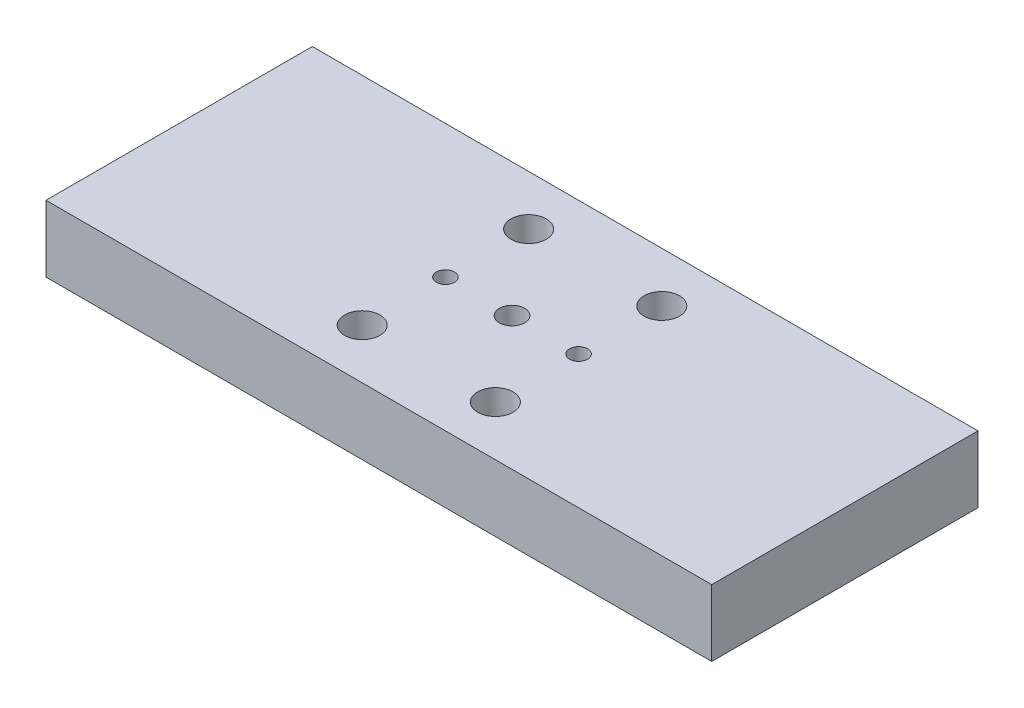
ISO-10303-21;
HEADER;
FILE_DESCRIPTION(('STEP AP214'),'2;1');
FILE_NAME('part.step','',(''),(''),'','','');
FILE_SCHEMA(('AUTOMOTIVE_DESIGN { 1 0 10303 214 1 1 1 1 }'));
ENDSEC;
DATA;
#1=APPLICATION_CONTEXT('core data for automotive mechanical design processes');
#2=APPLICATION_PROTOCOL_DEFINITION('international standard','automotive_design',2000,#1);
#3=PRODUCT_CONTEXT('',#1,'mechanical');
#4=PRODUCT('Part','Part','',(#3));
#5=PRODUCT_RELATED_PRODUCT_CATEGORY('part','',(#4));
#6=PRODUCT_DEFINITION_FORMATION('','',#4);
#7=PRODUCT_DEFINITION_CONTEXT('part definition',#1,'design');
#8=PRODUCT_DEFINITION('design','',#6,#7);
#9=PRODUCT_DEFINITION_SHAPE('','',#8);
#10=(LENGTH_UNIT() NAMED_UNIT(*) SI_UNIT(.MILLI.,.METRE.));
#11=(NAMED_UNIT(*) PLANE_ANGLE_UNIT() SI_UNIT($,.RADIAN.));
#12=(NAMED_UNIT(*) SI_UNIT($,.STERADIAN.) SOLID_ANGLE_UNIT());
#13=UNCERTAINTY_MEASURE_WITH_UNIT(LENGTH_MEASURE(1.E-05),#10,'distance_accuracy_value','');
#14=(GEOMETRIC_REPRESENTATION_CONTEXT(3) GLOBAL_UNCERTAINTY_ASSIGNED_CONTEXT((#13)) GLOBAL_UNIT_ASSIGNED_CONTEXT((#10,
#11,#12)) REPRESENTATION_CONTEXT('',''));
#15=CARTESIAN_POINT('',(0.,0.,0.));
#16=DIRECTION('',(0.,0.,1.));
#17=DIRECTION('',(1.,0.,0.));
#18=AXIS2_PLACEMENT_3D('',#15,#16,#17);
#19=CARTESIAN_POINT('',(-63.5,12.7,-25.4));
#20=DIRECTION('',(1.,0.,0.));
#21=DIRECTION('',(0.,0.,-1.));
#22=AXIS2_PLACEMENT_3D('',#19,#20,#21);
#23=PLANE('',#22);
#24=DIRECTION('',(0.,0.,1.));
#25=VECTOR('',#24,1.);
#26=CARTESIAN_POINT('',(-63.5,0.,-25.4));
#27=LINE('',#26,#25);
#28=CARTESIAN_POINT('',(-63.5,0.,-25.4));
#29=VERTEX_POINT('',#28);
#30=CARTESIAN_POINT('',(-63.5,0.,25.4));
#31=VERTEX_POINT('',#30);
#32=EDGE_CURVE('E112',#29,#31,#27,.T.);
#33=ORIENTED_EDGE('',*,*,#32,.T.);
#34=DIRECTION('',(0.,-1.,0.));
#35=VECTOR('',#34,1.);
#36=CARTESIAN_POINT('',(-63.5,12.7,25.4));
#37=LINE('',#36,#35);
#38=CARTESIAN_POINT('',(-63.5,12.7,25.4));
#39=VERTEX_POINT('',#38);
#40=EDGE_CURVE('E12',#39,#31,#37,.T.);
#41=ORIENTED_EDGE('',*,*,#40,.F.);
#42=DIRECTION('',(0.,0.,1.));
#43=VECTOR('',#42,1.);
#44=CARTESIAN_POINT('',(-63.5,12.7,-25.4));
#45=LINE('',#44,#43);
#46=CARTESIAN_POINT('',(-63.5,12.7,-25.4));
#47=VERTEX_POINT('',#46);
#48=EDGE_CURVE('E97',#47,#39,#45,.T.);
#49=ORIENTED_EDGE('',*,*,#48,.F.);
#50=DIRECTION('',(0.,-1.,0.));
#51=VECTOR('',#50,1.);
#52=CARTESIAN_POINT('',(-63.5,12.7,-25.4));
#53=LINE('',#52,#51);
#54=EDGE_CURVE('E109',#47,#29,#53,.T.);
#55=ORIENTED_EDGE('',*,*,#54,.T.);
#56=EDGE_LOOP('',(#33,#41,#49,#55));
#57=FACE_BOUND('',#56,.T.);
#58=ADVANCED_FACE('F41',(#57),#23,.F.);
#59=CARTESIAN_POINT('',(-63.5,12.7,25.4));
#60=DIRECTION('',(0.,0.,-1.));
#61=DIRECTION('',(-1.,0.,0.));
#62=AXIS2_PLACEMENT_3D('',#59,#60,#61);
#63=PLANE('',#62);
#64=DIRECTION('',(1.,0.,0.));
#65=VECTOR('',#64,1.);
#66=CARTESIAN_POINT('',(-63.5,0.,25.4));
#67=LINE('',#66,#65);
#68=CARTESIAN_POINT('',(63.5,0.,25.4));
#69=VERTEX_POINT('',#68);
#70=EDGE_CURVE('E102',#31,#69,#67,.T.);
#71=ORIENTED_EDGE('',*,*,#70,.T.);
#72=DIRECTION('',(0.,-1.,0.));
#73=VECTOR('',#72,1.);
#74=CARTESIAN_POINT('',(63.5,12.7,25.4));
#75=LINE('',#74,#73);
#76=CARTESIAN_POINT('',(63.5,12.7,25.4));
#77=VERTEX_POINT('',#76);
#78=EDGE_CURVE('E50',#77,#69,#75,.T.);
#79=ORIENTED_EDGE('',*,*,#78,.F.);
#80=DIRECTION('',(1.,0.,0.));
#81=VECTOR('',#80,1.);
#82=CARTESIAN_POINT('',(-63.5,12.7,25.4));
#83=LINE('',#82,#81);
#84=EDGE_CURVE('E92',#39,#77,#83,.T.);
#85=ORIENTED_EDGE('',*,*,#84,.F.);
#86=ORIENTED_EDGE('',*,*,#40,.T.);
#87=EDGE_LOOP('',(#71,#79,#85,#86));
#88=FACE_BOUND('',#87,.T.);
#89=ADVANCED_FACE('F101',(#88),#63,.F.);
#90=CARTESIAN_POINT('',(63.5,12.7,-25.4));
#91=DIRECTION('',(-1.,0.,0.));
#92=DIRECTION('',(0.,0.,1.));
#93=AXIS2_PLACEMENT_3D('',#90,#91,#92);
#94=PLANE('',#93);
#95=DIRECTION('',(0.,0.,-1.));
#96=VECTOR('',#95,1.);
#97=CARTESIAN_POINT('',(63.5,0.,-25.4));
#98=LINE('',#97,#96);
#99=CARTESIAN_POINT('',(63.5,0.,-25.4));
#100=VERTEX_POINT('',#99);
#101=EDGE_CURVE('E79',#69,#100,#98,.T.);
#102=ORIENTED_EDGE('',*,*,#101,.T.);
#103=DIRECTION('',(0.,-1.,0.));
#104=VECTOR('',#103,1.);
#105=CARTESIAN_POINT('',(63.5,12.7,-25.4));
#106=LINE('',#105,#104);
#107=CARTESIAN_POINT('',(63.5,12.7,-25.4));
#108=VERTEX_POINT('',#107);
#109=EDGE_CURVE('E104',#108,#100,#106,.T.);
#110=ORIENTED_EDGE('',*,*,#109,.F.);
#111=DIRECTION('',(0.,0.,-1.));
#112=VECTOR('',#111,1.);
#113=CARTESIAN_POINT('',(63.5,12.7,-25.4));
#114=LINE('',#113,#112);
#115=EDGE_CURVE('E95',#77,#108,#114,.T.);
#116=ORIENTED_EDGE('',*,*,#115,.F.);
#117=ORIENTED_EDGE('',*,*,#78,.T.);
#118=EDGE_LOOP('',(#102,#110,#116,#117));
#119=FACE_BOUND('',#118,.T.);
#120=ADVANCED_FACE('F105',(#119),#94,.F.);
#121=CARTESIAN_POINT('',(-63.5,12.7,-25.4));
#122=DIRECTION('',(0.,0.,1.));
#123=DIRECTION('',(1.,0.,0.));
#124=AXIS2_PLACEMENT_3D('',#121,#122,#123);
#125=PLANE('',#124);
#126=DIRECTION('',(-1.,0.,0.));
#127=VECTOR('',#126,1.);
#128=CARTESIAN_POINT('',(-63.5,0.,-25.4));
#129=LINE('',#128,#127);
#130=EDGE_CURVE('E85',#100,#29,#129,.T.);
#131=ORIENTED_EDGE('',*,*,#130,.T.);
#132=ORIENTED_EDGE('',*,*,#54,.F.);
#133=DIRECTION('',(-1.,0.,0.));
#134=VECTOR('',#133,1.);
#135=CARTESIAN_POINT('',(-63.5,12.7,-25.4));
#136=LINE('',#135,#134);
#137=EDGE_CURVE('E61',#108,#47,#136,.T.);
#138=ORIENTED_EDGE('',*,*,#137,.F.);
#139=ORIENTED_EDGE('',*,*,#109,.T.);
#140=EDGE_LOOP('',(#131,#132,#138,#139));
#141=FACE_BOUND('',#140,.T.);
#142=ADVANCED_FACE('F126',(#141),#125,.F.);
#143=CARTESIAN_POINT('',(0.,12.7,0.));
#144=DIRECTION('',(0.,1.,0.));
#145=DIRECTION('',(0.,0.,1.));
#146=AXIS2_PLACEMENT_3D('',#143,#144,#145);
#147=PLANE('',#146);
#148=CARTESIAN_POINT('',(12.7,12.7,0.));
#149=DIRECTION('',(0.,1.,0.));
#150=DIRECTION('',(0.,0.,1.));
#151=AXIS2_PLACEMENT_3D('',#148,#149,#150);
#152=CIRCLE('',#151,1.7272);
#153=CARTESIAN_POINT('',(12.7,12.7,1.7272));
#154=VERTEX_POINT('',#153);
#155=EDGE_CURVE('E294',#154,#154,#152,.T.);
#156=ORIENTED_EDGE('',*,*,#155,.F.);
#157=EDGE_LOOP('',(#156));
#158=FACE_BOUND('',#157,.T.);
#159=CARTESIAN_POINT('',(-12.7,12.7,0.));
#160=DIRECTION('',(0.,1.,0.));
#161=DIRECTION('',(0.,0.,1.));
#162=AXIS2_PLACEMENT_3D('',#159,#160,#161);
#163=CIRCLE('',#162,1.7272);
#164=CARTESIAN_POINT('',(-12.7,12.7,1.7272));
#165=VERTEX_POINT('',#164);
#166=EDGE_CURVE('E267',#165,#165,#163,.T.);
#167=ORIENTED_EDGE('',*,*,#166,.F.);
#168=EDGE_LOOP('',(#167));
#169=FACE_BOUND('',#168,.T.);
#170=CARTESIAN_POINT('',(-12.7,12.7,-15.875));
#171=DIRECTION('',(0.,1.,0.));
#172=DIRECTION('',(0.,0.,1.));
#173=AXIS2_PLACEMENT_3D('',#170,#171,#172);
#174=CIRCLE('',#173,3.3782);
#175=CARTESIAN_POINT('',(-12.7,12.7,-12.4968));
#176=VERTEX_POINT('',#175);
#177=EDGE_CURVE('E277',#176,#176,#174,.T.);
#178=ORIENTED_EDGE('',*,*,#177,.F.);
#179=EDGE_LOOP('',(#178));
#180=FACE_BOUND('',#179,.T.);
#181=CARTESIAN_POINT('',(12.7,12.7,-15.875));
#182=DIRECTION('',(0.,1.,0.));
#183=DIRECTION('',(0.,0.,1.));
#184=AXIS2_PLACEMENT_3D('',#181,#182,#183);
#185=CIRCLE('',#184,3.3782);
#186=CARTESIAN_POINT('',(12.7,12.7,-12.4968));
#187=VERTEX_POINT('',#186);
#188=EDGE_CURVE('E261',#187,#187,#185,.T.);
#189=ORIENTED_EDGE('',*,*,#188,.F.);
#190=EDGE_LOOP('',(#189));
#191=FACE_BOUND('',#190,.T.);
#192=CARTESIAN_POINT('',(-12.7,12.7,15.875));
#193=DIRECTION('',(0.,1.,0.));
#194=DIRECTION('',(0.,0.,1.));
#195=AXIS2_PLACEMENT_3D('',#192,#193,#194);
#196=CIRCLE('',#195,3.3782);
#197=CARTESIAN_POINT('',(-12.7,12.7,19.2532));
#198=VERTEX_POINT('',#197);
#199=EDGE_CURVE('E254',#198,#198,#196,.T.);
#200=ORIENTED_EDGE('',*,*,#199,.F.);
#201=EDGE_LOOP('',(#200));
#202=FACE_BOUND('',#201,.T.);
#203=CARTESIAN_POINT('',(12.7,12.7,15.875));
#204=DIRECTION('',(0.,1.,0.));
#205=DIRECTION('',(0.,0.,1.));
#206=AXIS2_PLACEMENT_3D('',#203,#204,#205);
#207=CIRCLE('',#206,3.3782);
#208=CARTESIAN_POINT('',(12.7,12.7,19.2532));
#209=VERTEX_POINT('',#208);
#210=EDGE_CURVE('E149',#209,#209,#207,.T.);
#211=ORIENTED_EDGE('',*,*,#210,.F.);
#212=EDGE_LOOP('',(#211));
#213=FACE_BOUND('',#212,.T.);
#214=CARTESIAN_POINT('',(0.,12.7,0.));
#215=DIRECTION('',(0.,1.,0.));
#216=DIRECTION('',(0.,0.,1.));
#217=AXIS2_PLACEMENT_3D('',#214,#215,#216);
#218=CIRCLE('',#217,2.413);
#219=CARTESIAN_POINT('',(0.,12.7,2.413));
#220=VERTEX_POINT('',#219);
#221=EDGE_CURVE('E134',#220,#220,#218,.T.);
#222=ORIENTED_EDGE('',*,*,#221,.F.);
#223=EDGE_LOOP('',(#222));
#224=FACE_BOUND('',#223,.T.);
#225=ORIENTED_EDGE('',*,*,#48,.T.);
#226=ORIENTED_EDGE('',*,*,#84,.T.);
#227=ORIENTED_EDGE('',*,*,#115,.T.);
#228=ORIENTED_EDGE('',*,*,#137,.T.);
#229=EDGE_LOOP('',(#225,#226,#227,#228));
#230=FACE_BOUND('',#229,.T.);
#231=ADVANCED_FACE('F93',(#158,#169,#180,#191,#202,#213,#224,#230),#147,.T.);
#232=CARTESIAN_POINT('',(0.,0.,0.));
#233=DIRECTION('',(0.,1.,0.));
#234=DIRECTION('',(0.,0.,1.));
#235=AXIS2_PLACEMENT_3D('',#232,#233,#234);
#236=PLANE('',#235);
#237=CARTESIAN_POINT('',(12.7,0.,0.));
#238=DIRECTION('',(0.,1.,0.));
#239=DIRECTION('',(0.,0.,1.));
#240=AXIS2_PLACEMENT_3D('',#237,#238,#239);
#241=CIRCLE('',#240,1.7272);
#242=CARTESIAN_POINT('',(12.7,0.,1.7272));
#243=VERTEX_POINT('',#242);
#244=EDGE_CURVE('E274',#243,#243,#241,.T.);
#245=ORIENTED_EDGE('',*,*,#244,.T.);
#246=EDGE_LOOP('',(#245));
#247=FACE_BOUND('',#246,.T.);
#248=CARTESIAN_POINT('',(-12.7,0.,0.));
#249=DIRECTION('',(0.,1.,0.));
#250=DIRECTION('',(0.,0.,1.));
#251=AXIS2_PLACEMENT_3D('',#248,#249,#250);
#252=CIRCLE('',#251,1.7272);
#253=CARTESIAN_POINT('',(-12.7,0.,1.7272));
#254=VERTEX_POINT('',#253);
#255=EDGE_CURVE('E273',#254,#254,#252,.T.);
#256=ORIENTED_EDGE('',*,*,#255,.T.);
#257=EDGE_LOOP('',(#256));
#258=FACE_BOUND('',#257,.T.);
#259=CARTESIAN_POINT('',(-12.7,0.,-15.875));
#260=DIRECTION('',(0.,1.,0.));
#261=DIRECTION('',(0.,0.,1.));
#262=AXIS2_PLACEMENT_3D('',#259,#260,#261);
#263=CIRCLE('',#262,3.3782);
#264=CARTESIAN_POINT('',(-12.7,0.,-12.4968));
#265=VERTEX_POINT('',#264);
#266=EDGE_CURVE('E282',#265,#265,#263,.T.);
#267=ORIENTED_EDGE('',*,*,#266,.T.);
#268=EDGE_LOOP('',(#267));
#269=FACE_BOUND('',#268,.T.);
#270=CARTESIAN_POINT('',(12.7,0.,-15.875));
#271=DIRECTION('',(0.,1.,0.));
#272=DIRECTION('',(0.,0.,1.));
#273=AXIS2_PLACEMENT_3D('',#270,#271,#272);
#274=CIRCLE('',#273,3.3782);
#275=CARTESIAN_POINT('',(12.7,0.,-12.4968));
#276=VERTEX_POINT('',#275);
#277=EDGE_CURVE('E257',#276,#276,#274,.T.);
#278=ORIENTED_EDGE('',*,*,#277,.T.);
#279=EDGE_LOOP('',(#278));
#280=FACE_BOUND('',#279,.T.);
#281=CARTESIAN_POINT('',(-12.7,0.,15.875));
#282=DIRECTION('',(0.,1.,0.));
#283=DIRECTION('',(0.,0.,1.));
#284=AXIS2_PLACEMENT_3D('',#281,#282,#283);
#285=CIRCLE('',#284,3.3782);
#286=CARTESIAN_POINT('',(-12.7,0.,19.2532));
#287=VERTEX_POINT('',#286);
#288=EDGE_CURVE('E154',#287,#287,#285,.T.);
#289=ORIENTED_EDGE('',*,*,#288,.T.);
#290=EDGE_LOOP('',(#289));
#291=FACE_BOUND('',#290,.T.);
#292=CARTESIAN_POINT('',(12.7,0.,15.875));
#293=DIRECTION('',(0.,1.,0.));
#294=DIRECTION('',(0.,0.,1.));
#295=AXIS2_PLACEMENT_3D('',#292,#293,#294);
#296=CIRCLE('',#295,3.3782);
#297=CARTESIAN_POINT('',(12.7,0.,19.2532));
#298=VERTEX_POINT('',#297);
#299=EDGE_CURVE('E139',#298,#298,#296,.T.);
#300=ORIENTED_EDGE('',*,*,#299,.T.);
#301=EDGE_LOOP('',(#300));
#302=FACE_BOUND('',#301,.T.);
#303=CARTESIAN_POINT('',(0.,0.,0.));
#304=DIRECTION('',(0.,1.,0.));
#305=DIRECTION('',(0.,0.,1.));
#306=AXIS2_PLACEMENT_3D('',#303,#304,#305);
#307=CIRCLE('',#306,2.413);
#308=CARTESIAN_POINT('',(0.,0.,2.413));
#309=VERTEX_POINT('',#308);
#310=EDGE_CURVE('E116',#309,#309,#307,.T.);
#311=ORIENTED_EDGE('',*,*,#310,.T.);
#312=EDGE_LOOP('',(#311));
#313=FACE_BOUND('',#312,.T.);
#314=ORIENTED_EDGE('',*,*,#32,.F.);
#315=ORIENTED_EDGE('',*,*,#130,.F.);
#316=ORIENTED_EDGE('',*,*,#101,.F.);
#317=ORIENTED_EDGE('',*,*,#70,.F.);
#318=EDGE_LOOP('',(#314,#315,#316,#317));
#319=FACE_BOUND('',#318,.T.);
#320=ADVANCED_FACE('F129',(#247,#258,#269,#280,#291,#302,#313,#319),#236,.F.);
#321=CARTESIAN_POINT('',(0.,0.,0.));
#322=DIRECTION('',(0.,1.,0.));
#323=DIRECTION('',(0.,0.,1.));
#324=AXIS2_PLACEMENT_3D('',#321,#322,#323);
#325=CYLINDRICAL_SURFACE('',#324,2.413);
#326=ORIENTED_EDGE('',*,*,#310,.F.);
#327=EDGE_LOOP('',(#326));
#328=FACE_BOUND('',#327,.T.);
#329=ORIENTED_EDGE('',*,*,#221,.T.);
#330=EDGE_LOOP('',(#329));
#331=FACE_BOUND('',#330,.T.);
#332=ADVANCED_FACE('F166',(#328,#331),#325,.F.);
#333=CARTESIAN_POINT('',(12.7,12.7,15.875));
#334=DIRECTION('',(0.,1.,0.));
#335=DIRECTION('',(0.,0.,1.));
#336=AXIS2_PLACEMENT_3D('',#333,#334,#335);
#337=CYLINDRICAL_SURFACE('',#336,3.3782);
#338=ORIENTED_EDGE('',*,*,#299,.F.);
#339=EDGE_LOOP('',(#338));
#340=FACE_BOUND('',#339,.T.);
#341=ORIENTED_EDGE('',*,*,#210,.T.);
#342=EDGE_LOOP('',(#341));
#343=FACE_BOUND('',#342,.T.);
#344=ADVANCED_FACE('F162',(#340,#343),#337,.F.);
#345=CARTESIAN_POINT('',(-12.7,12.7,15.875));
#346=DIRECTION('',(0.,1.,0.));
#347=DIRECTION('',(0.,0.,1.));
#348=AXIS2_PLACEMENT_3D('',#345,#346,#347);
#349=CYLINDRICAL_SURFACE('',#348,3.3782);
#350=ORIENTED_EDGE('',*,*,#288,.F.);
#351=EDGE_LOOP('',(#350));
#352=FACE_BOUND('',#351,.T.);
#353=ORIENTED_EDGE('',*,*,#199,.T.);
#354=EDGE_LOOP('',(#353));
#355=FACE_BOUND('',#354,.T.);
#356=ADVANCED_FACE('F165',(#352,#355),#349,.F.);
#357=CARTESIAN_POINT('',(12.7,12.7,-15.875));
#358=DIRECTION('',(0.,1.,0.));
#359=DIRECTION('',(0.,0.,1.));
#360=AXIS2_PLACEMENT_3D('',#357,#358,#359);
#361=CYLINDRICAL_SURFACE('',#360,3.3782);
#362=ORIENTED_EDGE('',*,*,#277,.F.);
#363=EDGE_LOOP('',(#362));
#364=FACE_BOUND('',#363,.T.);
#365=ORIENTED_EDGE('',*,*,#188,.T.);
#366=EDGE_LOOP('',(#365));
#367=FACE_BOUND('',#366,.T.);
#368=ADVANCED_FACE('F240',(#364,#367),#361,.F.);
#369=CARTESIAN_POINT('',(-12.7,12.7,-15.875));
#370=DIRECTION('',(0.,1.,0.));
#371=DIRECTION('',(0.,0.,1.));
#372=AXIS2_PLACEMENT_3D('',#369,#370,#371);
#373=CYLINDRICAL_SURFACE('',#372,3.3782);
#374=ORIENTED_EDGE('',*,*,#266,.F.);
#375=EDGE_LOOP('',(#374));
#376=FACE_BOUND('',#375,.T.);
#377=ORIENTED_EDGE('',*,*,#177,.T.);
#378=EDGE_LOOP('',(#377));
#379=FACE_BOUND('',#378,.T.);
#380=ADVANCED_FACE('F220',(#376,#379),#373,.F.);
#381=CARTESIAN_POINT('',(-12.7,12.7,0.));
#382=DIRECTION('',(0.,1.,0.));
#383=DIRECTION('',(0.,0.,1.));
#384=AXIS2_PLACEMENT_3D('',#381,#382,#383);
#385=CYLINDRICAL_SURFACE('',#384,1.7272);
#386=ORIENTED_EDGE('',*,*,#255,.F.);
#387=EDGE_LOOP('',(#386));
#388=FACE_BOUND('',#387,.T.);
#389=ORIENTED_EDGE('',*,*,#166,.T.);
#390=EDGE_LOOP('',(#389));
#391=FACE_BOUND('',#390,.T.);
#392=ADVANCED_FACE('F214',(#388,#391),#385,.F.);
#393=CARTESIAN_POINT('',(12.7,12.7,0.));
#394=DIRECTION('',(0.,1.,0.));
#395=DIRECTION('',(0.,0.,1.));
#396=AXIS2_PLACEMENT_3D('',#393,#394,#395);
#397=CYLINDRICAL_SURFACE('',#396,1.7272);
#398=ORIENTED_EDGE('',*,*,#244,.F.);
#399=EDGE_LOOP('',(#398));
#400=FACE_BOUND('',#399,.T.);
#401=ORIENTED_EDGE('',*,*,#155,.T.);
#402=EDGE_LOOP('',(#401));
#403=FACE_BOUND('',#402,.T.);
#404=ADVANCED_FACE('F219',(#400,#403),#397,.F.);
#405=CLOSED_SHELL('',(#58,#89,#120,#142,#231,#320,#332,#344,#356,#368,#380,#392,#404));
#406=MANIFOLD_SOLID_BREP('B2',#405);
#407=ADVANCED_BREP_SHAPE_REPRESENTATION('',(#18,#406),#14);
#408=SHAPE_DEFINITION_REPRESENTATION(#9,#407);
ENDSEC;
END-ISO-10303-21;
